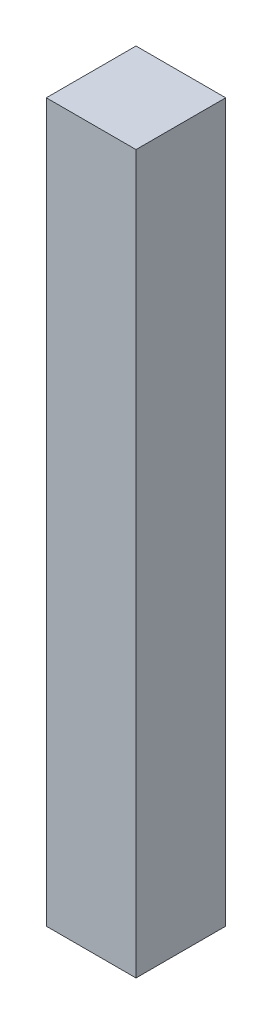
ISO-10303-21;
HEADER;
FILE_DESCRIPTION(('STEP AP214'),'2;1');
FILE_NAME('part.step','',(''),(''),'','','');
FILE_SCHEMA(('AUTOMOTIVE_DESIGN { 1 0 10303 214 1 1 1 1 }'));
ENDSEC;
DATA;
#1=APPLICATION_CONTEXT('core data for automotive mechanical design processes');
#2=APPLICATION_PROTOCOL_DEFINITION('international standard','automotive_design',2000,#1);
#3=PRODUCT_CONTEXT('',#1,'mechanical');
#4=PRODUCT('Part','Part','',(#3));
#5=PRODUCT_RELATED_PRODUCT_CATEGORY('part','',(#4));
#6=PRODUCT_DEFINITION_FORMATION('','',#4);
#7=PRODUCT_DEFINITION_CONTEXT('part definition',#1,'design');
#8=PRODUCT_DEFINITION('design','',#6,#7);
#9=PRODUCT_DEFINITION_SHAPE('','',#8);
#10=(LENGTH_UNIT() NAMED_UNIT(*) SI_UNIT(.MILLI.,.METRE.));
#11=(NAMED_UNIT(*) PLANE_ANGLE_UNIT() SI_UNIT($,.RADIAN.));
#12=(NAMED_UNIT(*) SI_UNIT($,.STERADIAN.) SOLID_ANGLE_UNIT());
#13=UNCERTAINTY_MEASURE_WITH_UNIT(LENGTH_MEASURE(1.E-05),#10,'distance_accuracy_value','');
#14=(GEOMETRIC_REPRESENTATION_CONTEXT(3) GLOBAL_UNCERTAINTY_ASSIGNED_CONTEXT((#13)) GLOBAL_UNIT_ASSIGNED_CONTEXT((#10,
#11,#12)) REPRESENTATION_CONTEXT('',''));
#15=CARTESIAN_POINT('',(0.,0.,0.));
#16=DIRECTION('',(0.,0.,1.));
#17=DIRECTION('',(1.,0.,0.));
#18=AXIS2_PLACEMENT_3D('',#15,#16,#17);
#19=CARTESIAN_POINT('',(-56.342492076348,49.3885978998226,2.5));
#20=DIRECTION('',(0.,1.,0.));
#21=DIRECTION('',(0.,0.,1.));
#22=AXIS2_PLACEMENT_3D('',#19,#20,#21);
#23=PLANE('',#22);
#24=DIRECTION('',(1.,0.,0.));
#25=VECTOR('',#24,1.);
#26=CARTESIAN_POINT('',(-56.342492076348,49.3885978998226,0.));
#27=LINE('',#26,#25);
#28=CARTESIAN_POINT('',(-56.342492076348,49.3885978998226,0.));
#29=VERTEX_POINT('',#28);
#30=CARTESIAN_POINT('',(-53.8424920763479,49.3885978998226,0.));
#31=VERTEX_POINT('',#30);
#32=EDGE_CURVE('E106',#29,#31,#27,.T.);
#33=ORIENTED_EDGE('',*,*,#32,.F.);
#34=DIRECTION('',(0.,0.,-1.));
#35=VECTOR('',#34,1.);
#36=CARTESIAN_POINT('',(-56.342492076348,49.3885978998226,2.5));
#37=LINE('',#36,#35);
#38=CARTESIAN_POINT('',(-56.342492076348,49.3885978998226,2.5));
#39=VERTEX_POINT('',#38);
#40=EDGE_CURVE('E11',#39,#29,#37,.T.);
#41=ORIENTED_EDGE('',*,*,#40,.F.);
#42=DIRECTION('',(1.,0.,0.));
#43=VECTOR('',#42,1.);
#44=CARTESIAN_POINT('',(-56.342492076348,49.3885978998226,2.5));
#45=LINE('',#44,#43);
#46=CARTESIAN_POINT('',(-53.8424920763479,49.3885978998226,2.5));
#47=VERTEX_POINT('',#46);
#48=EDGE_CURVE('E101',#39,#47,#45,.T.);
#49=ORIENTED_EDGE('',*,*,#48,.T.);
#50=DIRECTION('',(0.,0.,-1.));
#51=VECTOR('',#50,1.);
#52=CARTESIAN_POINT('',(-53.8424920763479,49.3885978998226,2.5));
#53=LINE('',#52,#51);
#54=EDGE_CURVE('E44',#47,#31,#53,.T.);
#55=ORIENTED_EDGE('',*,*,#54,.T.);
#56=EDGE_LOOP('',(#33,#41,#49,#55));
#57=FACE_BOUND('',#56,.T.);
#58=ADVANCED_FACE('F41',(#57),#23,.T.);
#59=CARTESIAN_POINT('',(-56.342492076348,49.3885978998226,2.5));
#60=DIRECTION('',(1.,0.,0.));
#61=DIRECTION('',(0.,1.,0.));
#62=AXIS2_PLACEMENT_3D('',#59,#60,#61);
#63=PLANE('',#62);
#64=DIRECTION('',(0.,-1.,0.));
#65=VECTOR('',#64,1.);
#66=CARTESIAN_POINT('',(-56.342492076348,49.3885978998226,0.));
#67=LINE('',#66,#65);
#68=CARTESIAN_POINT('',(-56.342492076348,29.3885978998226,0.));
#69=VERTEX_POINT('',#68);
#70=EDGE_CURVE('E74',#29,#69,#67,.T.);
#71=ORIENTED_EDGE('',*,*,#70,.T.);
#72=DIRECTION('',(0.,0.,-1.));
#73=VECTOR('',#72,1.);
#74=CARTESIAN_POINT('',(-56.342492076348,29.3885978998226,2.5));
#75=LINE('',#74,#73);
#76=CARTESIAN_POINT('',(-56.342492076348,29.3885978998226,2.5));
#77=VERTEX_POINT('',#76);
#78=EDGE_CURVE('E50',#77,#69,#75,.T.);
#79=ORIENTED_EDGE('',*,*,#78,.F.);
#80=DIRECTION('',(0.,-1.,0.));
#81=VECTOR('',#80,1.);
#82=CARTESIAN_POINT('',(-56.342492076348,49.3885978998226,2.5));
#83=LINE('',#82,#81);
#84=EDGE_CURVE('E91',#39,#77,#83,.T.);
#85=ORIENTED_EDGE('',*,*,#84,.F.);
#86=ORIENTED_EDGE('',*,*,#40,.T.);
#87=EDGE_LOOP('',(#71,#79,#85,#86));
#88=FACE_BOUND('',#87,.T.);
#89=ADVANCED_FACE('F116',(#88),#63,.F.);
#90=CARTESIAN_POINT('',(-56.342492076348,29.3885978998226,2.5));
#91=DIRECTION('',(0.,1.,0.));
#92=DIRECTION('',(0.,0.,1.));
#93=AXIS2_PLACEMENT_3D('',#90,#91,#92);
#94=PLANE('',#93);
#95=DIRECTION('',(1.,0.,0.));
#96=VECTOR('',#95,1.);
#97=CARTESIAN_POINT('',(-56.342492076348,29.3885978998226,0.));
#98=LINE('',#97,#96);
#99=CARTESIAN_POINT('',(-53.8424920763479,29.3885978998226,0.));
#100=VERTEX_POINT('',#99);
#101=EDGE_CURVE('E98',#69,#100,#98,.T.);
#102=ORIENTED_EDGE('',*,*,#101,.T.);
#103=DIRECTION('',(0.,0.,-1.));
#104=VECTOR('',#103,1.);
#105=CARTESIAN_POINT('',(-53.8424920763479,29.3885978998226,2.5));
#106=LINE('',#105,#104);
#107=CARTESIAN_POINT('',(-53.8424920763479,29.3885978998226,2.5));
#108=VERTEX_POINT('',#107);
#109=EDGE_CURVE('E95',#108,#100,#106,.T.);
#110=ORIENTED_EDGE('',*,*,#109,.F.);
#111=DIRECTION('',(1.,0.,0.));
#112=VECTOR('',#111,1.);
#113=CARTESIAN_POINT('',(-56.342492076348,29.3885978998226,2.5));
#114=LINE('',#113,#112);
#115=EDGE_CURVE('E86',#77,#108,#114,.T.);
#116=ORIENTED_EDGE('',*,*,#115,.F.);
#117=ORIENTED_EDGE('',*,*,#78,.T.);
#118=EDGE_LOOP('',(#102,#110,#116,#117));
#119=FACE_BOUND('',#118,.T.);
#120=ADVANCED_FACE('F96',(#119),#94,.F.);
#121=CARTESIAN_POINT('',(-53.8424920763479,49.3885978998226,2.5));
#122=DIRECTION('',(1.,0.,0.));
#123=DIRECTION('',(0.,0.,-1.));
#124=AXIS2_PLACEMENT_3D('',#121,#122,#123);
#125=PLANE('',#124);
#126=DIRECTION('',(0.,-1.,0.));
#127=VECTOR('',#126,1.);
#128=CARTESIAN_POINT('',(-53.8424920763479,49.3885978998226,0.));
#129=LINE('',#128,#127);
#130=EDGE_CURVE('E109',#31,#100,#129,.T.);
#131=ORIENTED_EDGE('',*,*,#130,.F.);
#132=ORIENTED_EDGE('',*,*,#54,.F.);
#133=DIRECTION('',(0.,-1.,0.));
#134=VECTOR('',#133,1.);
#135=CARTESIAN_POINT('',(-53.8424920763479,49.3885978998226,2.5));
#136=LINE('',#135,#134);
#137=EDGE_CURVE('E90',#47,#108,#136,.T.);
#138=ORIENTED_EDGE('',*,*,#137,.T.);
#139=ORIENTED_EDGE('',*,*,#109,.T.);
#140=EDGE_LOOP('',(#131,#132,#138,#139));
#141=FACE_BOUND('',#140,.T.);
#142=ADVANCED_FACE('F100',(#141),#125,.T.);
#143=CARTESIAN_POINT('',(0.,0.,2.5));
#144=DIRECTION('',(0.,0.,-1.));
#145=DIRECTION('',(-1.,0.,0.));
#146=AXIS2_PLACEMENT_3D('',#143,#144,#145);
#147=PLANE('',#146);
#148=ORIENTED_EDGE('',*,*,#48,.F.);
#149=ORIENTED_EDGE('',*,*,#84,.T.);
#150=ORIENTED_EDGE('',*,*,#115,.T.);
#151=ORIENTED_EDGE('',*,*,#137,.F.);
#152=EDGE_LOOP('',(#148,#149,#150,#151));
#153=FACE_BOUND('',#152,.T.);
#154=ADVANCED_FACE('F89',(#153),#147,.F.);
#155=CARTESIAN_POINT('',(0.,0.,0.));
#156=DIRECTION('',(0.,0.,-1.));
#157=DIRECTION('',(-1.,0.,0.));
#158=AXIS2_PLACEMENT_3D('',#155,#156,#157);
#159=PLANE('',#158);
#160=ORIENTED_EDGE('',*,*,#32,.T.);
#161=ORIENTED_EDGE('',*,*,#130,.T.);
#162=ORIENTED_EDGE('',*,*,#101,.F.);
#163=ORIENTED_EDGE('',*,*,#70,.F.);
#164=EDGE_LOOP('',(#160,#161,#162,#163));
#165=FACE_BOUND('',#164,.T.);
#166=ADVANCED_FACE('F114',(#165),#159,.T.);
#167=CLOSED_SHELL('',(#58,#89,#120,#142,#154,#166));
#168=MANIFOLD_SOLID_BREP('B2',#167);
#169=ADVANCED_BREP_SHAPE_REPRESENTATION('',(#18,#168),#14);
#170=SHAPE_DEFINITION_REPRESENTATION(#9,#169);
ENDSEC;
END-ISO-10303-21;
